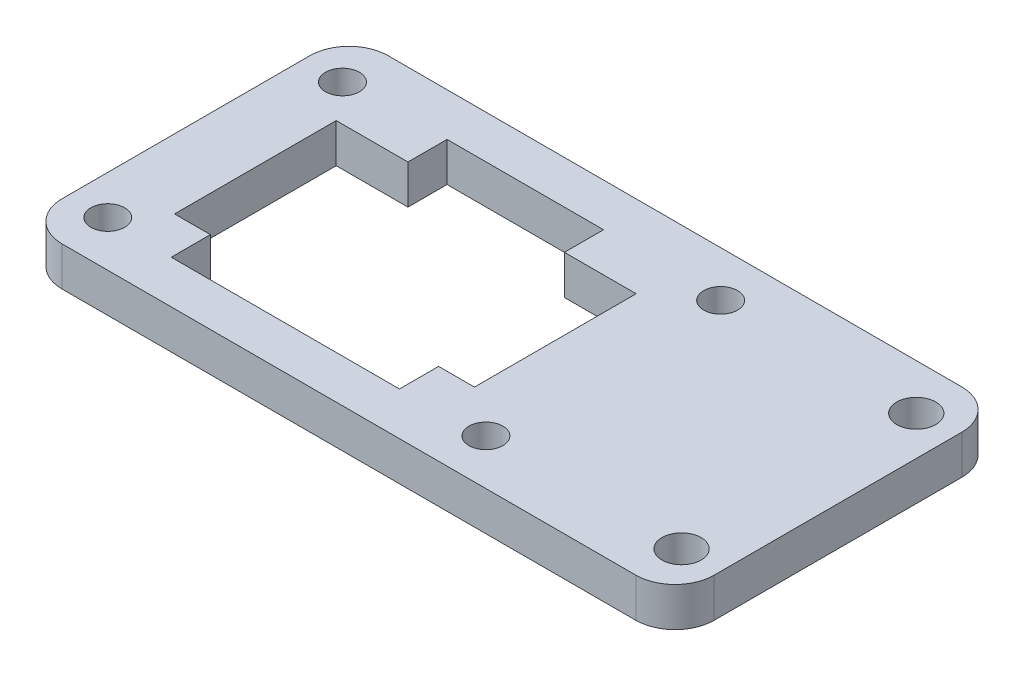
ISO-10303-21;
HEADER;
FILE_DESCRIPTION(('STEP AP214'),'2;1');
FILE_NAME('part.step','',(''),(''),'','','');
FILE_SCHEMA(('AUTOMOTIVE_DESIGN { 1 0 10303 214 1 1 1 1 }'));
ENDSEC;
DATA;
#1=APPLICATION_CONTEXT('core data for automotive mechanical design processes');
#2=APPLICATION_PROTOCOL_DEFINITION('international standard','automotive_design',2000,#1);
#3=PRODUCT_CONTEXT('',#1,'mechanical');
#4=PRODUCT('Part','Part','',(#3));
#5=PRODUCT_RELATED_PRODUCT_CATEGORY('part','',(#4));
#6=PRODUCT_DEFINITION_FORMATION('','',#4);
#7=PRODUCT_DEFINITION_CONTEXT('part definition',#1,'design');
#8=PRODUCT_DEFINITION('design','',#6,#7);
#9=PRODUCT_DEFINITION_SHAPE('','',#8);
#10=(LENGTH_UNIT() NAMED_UNIT(*) SI_UNIT(.MILLI.,.METRE.));
#11=(NAMED_UNIT(*) PLANE_ANGLE_UNIT() SI_UNIT($,.RADIAN.));
#12=(NAMED_UNIT(*) SI_UNIT($,.STERADIAN.) SOLID_ANGLE_UNIT());
#13=UNCERTAINTY_MEASURE_WITH_UNIT(LENGTH_MEASURE(1.E-05),#10,'distance_accuracy_value','');
#14=(GEOMETRIC_REPRESENTATION_CONTEXT(3) GLOBAL_UNCERTAINTY_ASSIGNED_CONTEXT((#13)) GLOBAL_UNIT_ASSIGNED_CONTEXT((#10,
#11,#12)) REPRESENTATION_CONTEXT('',''));
#15=CARTESIAN_POINT('',(0.,0.,0.));
#16=DIRECTION('',(0.,0.,1.));
#17=DIRECTION('',(1.,0.,0.));
#18=AXIS2_PLACEMENT_3D('',#15,#16,#17);
#19=CARTESIAN_POINT('',(3.32,3.,6.20000000000001));
#20=DIRECTION('',(0.,0.,1.));
#21=DIRECTION('',(1.,0.,0.));
#22=AXIS2_PLACEMENT_3D('',#19,#20,#21);
#23=PLANE('',#22);
#24=DIRECTION('',(-1.,0.,0.));
#25=VECTOR('',#24,1.);
#26=CARTESIAN_POINT('',(3.32,3.,6.20000000000001));
#27=LINE('',#26,#25);
#28=CARTESIAN_POINT('',(-16.93,3.,6.20000000000001));
#29=VERTEX_POINT('',#28);
#30=CARTESIAN_POINT('',(-19.68,3.,6.2));
#31=VERTEX_POINT('',#30);
#32=EDGE_CURVE('E251',#29,#31,#27,.T.);
#33=ORIENTED_EDGE('',*,*,#32,.F.);
#34=DIRECTION('',(0.,-1.,0.));
#35=VECTOR('',#34,1.);
#36=CARTESIAN_POINT('',(-16.93,3.,6.20000000000001));
#37=LINE('',#36,#35);
#38=CARTESIAN_POINT('',(-16.93,0.,6.20000000000001));
#39=VERTEX_POINT('',#38);
#40=EDGE_CURVE('E228',#29,#39,#37,.T.);
#41=ORIENTED_EDGE('',*,*,#40,.T.);
#42=DIRECTION('',(-1.,0.,0.));
#43=VECTOR('',#42,1.);
#44=CARTESIAN_POINT('',(3.32,0.,6.20000000000001));
#45=LINE('',#44,#43);
#46=CARTESIAN_POINT('',(-19.68,0.,6.2));
#47=VERTEX_POINT('',#46);
#48=EDGE_CURVE('E264',#39,#47,#45,.T.);
#49=ORIENTED_EDGE('',*,*,#48,.T.);
#50=DIRECTION('',(0.,-1.,0.));
#51=VECTOR('',#50,1.);
#52=CARTESIAN_POINT('',(-19.68,3.,6.2));
#53=LINE('',#52,#51);
#54=EDGE_CURVE('E267',#31,#47,#53,.T.);
#55=ORIENTED_EDGE('',*,*,#54,.F.);
#56=EDGE_LOOP('',(#33,#41,#49,#55));
#57=FACE_BOUND('',#56,.T.);
#58=ADVANCED_FACE('F36',(#57),#23,.F.);
#59=CARTESIAN_POINT('',(3.32,3.,-6.19999999999998));
#60=DIRECTION('',(0.,0.,-1.));
#61=DIRECTION('',(-1.,0.,0.));
#62=AXIS2_PLACEMENT_3D('',#59,#60,#61);
#63=PLANE('',#62);
#64=DIRECTION('',(1.,0.,0.));
#65=VECTOR('',#64,1.);
#66=CARTESIAN_POINT('',(3.32,0.,-6.19999999999998));
#67=LINE('',#66,#65);
#68=CARTESIAN_POINT('',(-19.68,0.,-6.2));
#69=VERTEX_POINT('',#68);
#70=CARTESIAN_POINT('',(-14.18,0.,-6.19999999999998));
#71=VERTEX_POINT('',#70);
#72=EDGE_CURVE('E258',#69,#71,#67,.T.);
#73=ORIENTED_EDGE('',*,*,#72,.T.);
#74=DIRECTION('',(0.,-1.,0.));
#75=VECTOR('',#74,1.);
#76=CARTESIAN_POINT('',(-14.18,3.,-6.19999999999998));
#77=LINE('',#76,#75);
#78=CARTESIAN_POINT('',(-14.18,3.,-6.19999999999998));
#79=VERTEX_POINT('',#78);
#80=EDGE_CURVE('E211',#79,#71,#77,.T.);
#81=ORIENTED_EDGE('',*,*,#80,.F.);
#82=DIRECTION('',(1.,0.,0.));
#83=VECTOR('',#82,1.);
#84=CARTESIAN_POINT('',(3.32,3.,-6.19999999999998));
#85=LINE('',#84,#83);
#86=CARTESIAN_POINT('',(-19.68,3.,-6.2));
#87=VERTEX_POINT('',#86);
#88=EDGE_CURVE('E198',#87,#79,#85,.T.);
#89=ORIENTED_EDGE('',*,*,#88,.F.);
#90=DIRECTION('',(0.,-1.,0.));
#91=VECTOR('',#90,1.);
#92=CARTESIAN_POINT('',(-19.68,3.,-6.2));
#93=LINE('',#92,#91);
#94=EDGE_CURVE('E255',#87,#69,#93,.T.);
#95=ORIENTED_EDGE('',*,*,#94,.T.);
#96=EDGE_LOOP('',(#73,#81,#89,#95));
#97=FACE_BOUND('',#96,.T.);
#98=ADVANCED_FACE('F365',(#97),#63,.F.);
#99=CARTESIAN_POINT('',(-25.,3.,12.5));
#100=DIRECTION('',(0.,0.,-1.));
#101=DIRECTION('',(-1.,0.,0.));
#102=AXIS2_PLACEMENT_3D('',#99,#100,#101);
#103=PLANE('',#102);
#104=DIRECTION('',(1.,0.,0.));
#105=VECTOR('',#104,1.);
#106=CARTESIAN_POINT('',(-25.,0.,12.5));
#107=LINE('',#106,#105);
#108=CARTESIAN_POINT('',(-22.,0.,12.5));
#109=VERTEX_POINT('',#108);
#110=CARTESIAN_POINT('',(22.,0.,12.5));
#111=VERTEX_POINT('',#110);
#112=EDGE_CURVE('E270',#109,#111,#107,.T.);
#113=ORIENTED_EDGE('',*,*,#112,.T.);
#114=DIRECTION('',(0.,-1.,0.));
#115=VECTOR('',#114,1.);
#116=CARTESIAN_POINT('',(22.,3.,12.5));
#117=LINE('',#116,#115);
#118=CARTESIAN_POINT('',(22.,3.,12.5));
#119=VERTEX_POINT('',#118);
#120=EDGE_CURVE('E11',#111,#119,#117,.F.);
#121=ORIENTED_EDGE('',*,*,#120,.T.);
#122=DIRECTION('',(1.,0.,0.));
#123=VECTOR('',#122,1.);
#124=CARTESIAN_POINT('',(-25.,3.,12.5));
#125=LINE('',#124,#123);
#126=CARTESIAN_POINT('',(-22.,3.,12.5));
#127=VERTEX_POINT('',#126);
#128=EDGE_CURVE('E278',#127,#119,#125,.T.);
#129=ORIENTED_EDGE('',*,*,#128,.F.);
#130=DIRECTION('',(0.,-1.,0.));
#131=VECTOR('',#130,1.);
#132=CARTESIAN_POINT('',(-22.,0.,12.5));
#133=LINE('',#132,#131);
#134=EDGE_CURVE('E44',#127,#109,#133,.T.);
#135=ORIENTED_EDGE('',*,*,#134,.T.);
#136=EDGE_LOOP('',(#113,#121,#129,#135));
#137=FACE_BOUND('',#136,.T.);
#138=ADVANCED_FACE('F331',(#137),#103,.F.);
#139=CARTESIAN_POINT('',(25.,3.,12.5));
#140=DIRECTION('',(-1.,0.,0.));
#141=DIRECTION('',(0.,0.,1.));
#142=AXIS2_PLACEMENT_3D('',#139,#140,#141);
#143=PLANE('',#142);
#144=DIRECTION('',(0.,0.,-1.));
#145=VECTOR('',#144,1.);
#146=CARTESIAN_POINT('',(25.,0.,12.5));
#147=LINE('',#146,#145);
#148=CARTESIAN_POINT('',(25.,0.,9.5));
#149=VERTEX_POINT('',#148);
#150=CARTESIAN_POINT('',(25.,0.,-9.5));
#151=VERTEX_POINT('',#150);
#152=EDGE_CURVE('E292',#149,#151,#147,.T.);
#153=ORIENTED_EDGE('',*,*,#152,.T.);
#154=DIRECTION('',(0.,-1.,0.));
#155=VECTOR('',#154,1.);
#156=CARTESIAN_POINT('',(25.,3.,-9.5));
#157=LINE('',#156,#155);
#158=CARTESIAN_POINT('',(25.,3.,-9.5));
#159=VERTEX_POINT('',#158);
#160=EDGE_CURVE('E51',#151,#159,#157,.F.);
#161=ORIENTED_EDGE('',*,*,#160,.T.);
#162=DIRECTION('',(0.,0.,-1.));
#163=VECTOR('',#162,1.);
#164=CARTESIAN_POINT('',(25.,3.,12.5));
#165=LINE('',#164,#163);
#166=CARTESIAN_POINT('',(25.,3.,9.5));
#167=VERTEX_POINT('',#166);
#168=EDGE_CURVE('E280',#167,#159,#165,.T.);
#169=ORIENTED_EDGE('',*,*,#168,.F.);
#170=DIRECTION('',(0.,-1.,0.));
#171=VECTOR('',#170,1.);
#172=CARTESIAN_POINT('',(25.,3.,9.5));
#173=LINE('',#172,#171);
#174=EDGE_CURVE('E323',#167,#149,#173,.T.);
#175=ORIENTED_EDGE('',*,*,#174,.T.);
#176=EDGE_LOOP('',(#153,#161,#169,#175));
#177=FACE_BOUND('',#176,.T.);
#178=ADVANCED_FACE('F342',(#177),#143,.F.);
#179=CARTESIAN_POINT('',(-25.,3.,-12.5));
#180=DIRECTION('',(0.,0.,-1.));
#181=DIRECTION('',(-1.,0.,0.));
#182=AXIS2_PLACEMENT_3D('',#179,#180,#181);
#183=PLANE('',#182);
#184=DIRECTION('',(1.,0.,0.));
#185=VECTOR('',#184,1.);
#186=CARTESIAN_POINT('',(-25.,0.,-12.5));
#187=LINE('',#186,#185);
#188=CARTESIAN_POINT('',(-22.,0.,-12.5));
#189=VERTEX_POINT('',#188);
#190=CARTESIAN_POINT('',(22.,0.,-12.5));
#191=VERTEX_POINT('',#190);
#192=EDGE_CURVE('E294',#189,#191,#187,.T.);
#193=ORIENTED_EDGE('',*,*,#192,.F.);
#194=DIRECTION('',(0.,-1.,0.));
#195=VECTOR('',#194,1.);
#196=CARTESIAN_POINT('',(-22.,3.,-12.5));
#197=LINE('',#196,#195);
#198=CARTESIAN_POINT('',(-22.,3.,-12.5));
#199=VERTEX_POINT('',#198);
#200=EDGE_CURVE('E314',#189,#199,#197,.F.);
#201=ORIENTED_EDGE('',*,*,#200,.T.);
#202=DIRECTION('',(1.,0.,0.));
#203=VECTOR('',#202,1.);
#204=CARTESIAN_POINT('',(-25.,3.,-12.5));
#205=LINE('',#204,#203);
#206=CARTESIAN_POINT('',(22.,3.,-12.5));
#207=VERTEX_POINT('',#206);
#208=EDGE_CURVE('E283',#199,#207,#205,.T.);
#209=ORIENTED_EDGE('',*,*,#208,.T.);
#210=DIRECTION('',(0.,-1.,0.));
#211=VECTOR('',#210,1.);
#212=CARTESIAN_POINT('',(22.,0.,-12.5));
#213=LINE('',#212,#211);
#214=EDGE_CURVE('E311',#207,#191,#213,.T.);
#215=ORIENTED_EDGE('',*,*,#214,.T.);
#216=EDGE_LOOP('',(#193,#201,#209,#215));
#217=FACE_BOUND('',#216,.T.);
#218=ADVANCED_FACE('F350',(#217),#183,.T.);
#219=CARTESIAN_POINT('',(-25.,3.,12.5));
#220=DIRECTION('',(-1.,0.,0.));
#221=DIRECTION('',(0.,0.,1.));
#222=AXIS2_PLACEMENT_3D('',#219,#220,#221);
#223=PLANE('',#222);
#224=DIRECTION('',(0.,0.,-1.));
#225=VECTOR('',#224,1.);
#226=CARTESIAN_POINT('',(-25.,3.,12.5));
#227=LINE('',#226,#225);
#228=CARTESIAN_POINT('',(-25.,3.,9.5));
#229=VERTEX_POINT('',#228);
#230=CARTESIAN_POINT('',(-25.,3.,-9.5));
#231=VERTEX_POINT('',#230);
#232=EDGE_CURVE('E286',#229,#231,#227,.T.);
#233=ORIENTED_EDGE('',*,*,#232,.T.);
#234=DIRECTION('',(0.,-1.,0.));
#235=VECTOR('',#234,1.);
#236=CARTESIAN_POINT('',(-25.,3.,-9.5));
#237=LINE('',#236,#235);
#238=CARTESIAN_POINT('',(-25.,0.,-9.5));
#239=VERTEX_POINT('',#238);
#240=EDGE_CURVE('E300',#231,#239,#237,.T.);
#241=ORIENTED_EDGE('',*,*,#240,.T.);
#242=DIRECTION('',(0.,0.,-1.));
#243=VECTOR('',#242,1.);
#244=CARTESIAN_POINT('',(-25.,0.,12.5));
#245=LINE('',#244,#243);
#246=CARTESIAN_POINT('',(-25.,0.,9.5));
#247=VERTEX_POINT('',#246);
#248=EDGE_CURVE('E281',#247,#239,#245,.T.);
#249=ORIENTED_EDGE('',*,*,#248,.F.);
#250=DIRECTION('',(0.,-1.,0.));
#251=VECTOR('',#250,1.);
#252=CARTESIAN_POINT('',(-25.,3.,9.5));
#253=LINE('',#252,#251);
#254=EDGE_CURVE('E289',#247,#229,#253,.F.);
#255=ORIENTED_EDGE('',*,*,#254,.T.);
#256=EDGE_LOOP('',(#233,#241,#249,#255));
#257=FACE_BOUND('',#256,.T.);
#258=ADVANCED_FACE('F357',(#257),#223,.T.);
#259=CARTESIAN_POINT('',(0.,3.,0.));
#260=DIRECTION('',(0.,1.,0.));
#261=DIRECTION('',(0.,0.,1.));
#262=AXIS2_PLACEMENT_3D('',#259,#260,#261);
#263=PLANE('',#262);
#264=CARTESIAN_POINT('',(-22.,3.,-9.));
#265=DIRECTION('',(0.,1.,0.));
#266=DIRECTION('',(0.,0.,1.));
#267=AXIS2_PLACEMENT_3D('',#264,#265,#266);
#268=CIRCLE('',#267,1.3);
#269=CARTESIAN_POINT('',(-22.,3.,-7.7));
#270=VERTEX_POINT('',#269);
#271=EDGE_CURVE('E661',#270,#270,#268,.T.);
#272=ORIENTED_EDGE('',*,*,#271,.F.);
#273=EDGE_LOOP('',(#272));
#274=FACE_BOUND('',#273,.T.);
#275=CARTESIAN_POINT('',(-22.,3.,9.));
#276=DIRECTION('',(0.,1.,0.));
#277=DIRECTION('',(0.,0.,1.));
#278=AXIS2_PLACEMENT_3D('',#275,#276,#277);
#279=CIRCLE('',#278,1.3);
#280=CARTESIAN_POINT('',(-22.,3.,10.3));
#281=VERTEX_POINT('',#280);
#282=EDGE_CURVE('E665',#281,#281,#279,.T.);
#283=ORIENTED_EDGE('',*,*,#282,.F.);
#284=EDGE_LOOP('',(#283));
#285=FACE_BOUND('',#284,.T.);
#286=CARTESIAN_POINT('',(7.,3.,-9.));
#287=DIRECTION('',(0.,1.,0.));
#288=DIRECTION('',(0.,0.,1.));
#289=AXIS2_PLACEMENT_3D('',#286,#287,#288);
#290=CIRCLE('',#289,1.3);
#291=CARTESIAN_POINT('',(7.,3.,-7.7));
#292=VERTEX_POINT('',#291);
#293=EDGE_CURVE('E669',#292,#292,#290,.T.);
#294=ORIENTED_EDGE('',*,*,#293,.F.);
#295=EDGE_LOOP('',(#294));
#296=FACE_BOUND('',#295,.T.);
#297=CARTESIAN_POINT('',(7.,3.,9.));
#298=DIRECTION('',(0.,1.,0.));
#299=DIRECTION('',(0.,0.,1.));
#300=AXIS2_PLACEMENT_3D('',#297,#298,#299);
#301=CIRCLE('',#300,1.3);
#302=CARTESIAN_POINT('',(7.,3.,10.3));
#303=VERTEX_POINT('',#302);
#304=EDGE_CURVE('E673',#303,#303,#301,.T.);
#305=ORIENTED_EDGE('',*,*,#304,.F.);
#306=EDGE_LOOP('',(#305));
#307=FACE_BOUND('',#306,.T.);
#308=CARTESIAN_POINT('',(22.,3.,-9.));
#309=DIRECTION('',(0.,1.,0.));
#310=DIRECTION('',(0.,0.,1.));
#311=AXIS2_PLACEMENT_3D('',#308,#309,#310);
#312=CIRCLE('',#311,1.49999999999999);
#313=CARTESIAN_POINT('',(22.,3.,-7.50000000000001));
#314=VERTEX_POINT('',#313);
#315=EDGE_CURVE('E677',#314,#314,#312,.T.);
#316=ORIENTED_EDGE('',*,*,#315,.F.);
#317=EDGE_LOOP('',(#316));
#318=FACE_BOUND('',#317,.T.);
#319=CARTESIAN_POINT('',(22.,3.,9.));
#320=DIRECTION('',(0.,1.,0.));
#321=DIRECTION('',(0.,0.,1.));
#322=AXIS2_PLACEMENT_3D('',#319,#320,#321);
#323=CIRCLE('',#322,1.49999999999999);
#324=CARTESIAN_POINT('',(22.,3.,10.5));
#325=VERTEX_POINT('',#324);
#326=EDGE_CURVE('E680',#325,#325,#323,.T.);
#327=ORIENTED_EDGE('',*,*,#326,.F.);
#328=EDGE_LOOP('',(#327));
#329=FACE_BOUND('',#328,.T.);
#330=DIRECTION('',(0.,0.,-1.));
#331=VECTOR('',#330,1.);
#332=CARTESIAN_POINT('',(-14.18,3.,-9.19999999999999));
#333=LINE('',#332,#331);
#334=CARTESIAN_POINT('',(-14.18,3.,-9.19999999999999));
#335=VERTEX_POINT('',#334);
#336=EDGE_CURVE('E177',#79,#335,#333,.T.);
#337=ORIENTED_EDGE('',*,*,#336,.T.);
#338=DIRECTION('',(1.,0.,0.));
#339=VECTOR('',#338,1.);
#340=CARTESIAN_POINT('',(-2.18,3.,-9.19999999999999));
#341=LINE('',#340,#339);
#342=CARTESIAN_POINT('',(-2.18,3.,-9.19999999999999));
#343=VERTEX_POINT('',#342);
#344=EDGE_CURVE('E188',#335,#343,#341,.T.);
#345=ORIENTED_EDGE('',*,*,#344,.T.);
#346=DIRECTION('',(0.,0.,1.));
#347=VECTOR('',#346,1.);
#348=CARTESIAN_POINT('',(-2.18,3.,-9.19999999999999));
#349=LINE('',#348,#347);
#350=CARTESIAN_POINT('',(-2.17999999999999,3.,-6.19999999999999));
#351=VERTEX_POINT('',#350);
#352=EDGE_CURVE('E185',#343,#351,#349,.T.);
#353=ORIENTED_EDGE('',*,*,#352,.T.);
#354=CARTESIAN_POINT('',(3.32,3.,-6.19999999999998));
#355=VERTEX_POINT('',#354);
#356=EDGE_CURVE('E245',#351,#355,#85,.T.);
#357=ORIENTED_EDGE('',*,*,#356,.T.);
#358=DIRECTION('',(0.,0.,1.));
#359=VECTOR('',#358,1.);
#360=CARTESIAN_POINT('',(3.32,3.,6.20000000000001));
#361=LINE('',#360,#359);
#362=CARTESIAN_POINT('',(3.32,3.,6.20000000000001));
#363=VERTEX_POINT('',#362);
#364=EDGE_CURVE('E248',#355,#363,#361,.T.);
#365=ORIENTED_EDGE('',*,*,#364,.T.);
#366=CARTESIAN_POINT('',(0.570000000000001,3.,6.20000000000001));
#367=VERTEX_POINT('',#366);
#368=EDGE_CURVE('E252',#363,#367,#27,.T.);
#369=ORIENTED_EDGE('',*,*,#368,.T.);
#370=DIRECTION('',(0.,0.,1.));
#371=VECTOR('',#370,1.);
#372=CARTESIAN_POINT('',(0.570000000000001,3.,9.20000000000001));
#373=LINE('',#372,#371);
#374=CARTESIAN_POINT('',(0.570000000000001,3.,9.20000000000001));
#375=VERTEX_POINT('',#374);
#376=EDGE_CURVE('E221',#367,#375,#373,.T.);
#377=ORIENTED_EDGE('',*,*,#376,.T.);
#378=DIRECTION('',(-1.,0.,0.));
#379=VECTOR('',#378,1.);
#380=CARTESIAN_POINT('',(0.570000000000001,3.,9.20000000000001));
#381=LINE('',#380,#379);
#382=CARTESIAN_POINT('',(-16.93,3.,9.20000000000001));
#383=VERTEX_POINT('',#382);
#384=EDGE_CURVE('E225',#375,#383,#381,.T.);
#385=ORIENTED_EDGE('',*,*,#384,.T.);
#386=DIRECTION('',(0.,0.,-1.));
#387=VECTOR('',#386,1.);
#388=CARTESIAN_POINT('',(-16.93,3.,9.20000000000001));
#389=LINE('',#388,#387);
#390=EDGE_CURVE('E218',#383,#29,#389,.T.);
#391=ORIENTED_EDGE('',*,*,#390,.T.);
#392=ORIENTED_EDGE('',*,*,#32,.T.);
#393=DIRECTION('',(0.,0.,-1.));
#394=VECTOR('',#393,1.);
#395=CARTESIAN_POINT('',(-19.68,3.,6.2));
#396=LINE('',#395,#394);
#397=EDGE_CURVE('E243',#31,#87,#396,.T.);
#398=ORIENTED_EDGE('',*,*,#397,.T.);
#399=ORIENTED_EDGE('',*,*,#88,.T.);
#400=EDGE_LOOP('',(#337,#345,#353,#357,#365,#369,#377,#385,#391,#392,#398,#399));
#401=FACE_BOUND('',#400,.T.);
#402=ORIENTED_EDGE('',*,*,#208,.F.);
#403=CARTESIAN_POINT('',(-22.,3.,-9.5));
#404=DIRECTION('',(0.,1.,0.));
#405=DIRECTION('',(0.,0.,1.));
#406=AXIS2_PLACEMENT_3D('',#403,#404,#405);
#407=CIRCLE('',#406,3.);
#408=EDGE_CURVE('E321',#199,#231,#407,.T.);
#409=ORIENTED_EDGE('',*,*,#408,.T.);
#410=ORIENTED_EDGE('',*,*,#232,.F.);
#411=CARTESIAN_POINT('',(-22.,3.,9.5));
#412=DIRECTION('',(0.,1.,0.));
#413=DIRECTION('',(0.,0.,1.));
#414=AXIS2_PLACEMENT_3D('',#411,#412,#413);
#415=CIRCLE('',#414,3.);
#416=EDGE_CURVE('E316',#229,#127,#415,.T.);
#417=ORIENTED_EDGE('',*,*,#416,.T.);
#418=ORIENTED_EDGE('',*,*,#128,.T.);
#419=CARTESIAN_POINT('',(22.,3.,9.5));
#420=DIRECTION('',(0.,1.,0.));
#421=DIRECTION('',(0.,0.,1.));
#422=AXIS2_PLACEMENT_3D('',#419,#420,#421);
#423=CIRCLE('',#422,3.);
#424=EDGE_CURVE('E58',#119,#167,#423,.T.);
#425=ORIENTED_EDGE('',*,*,#424,.T.);
#426=ORIENTED_EDGE('',*,*,#168,.T.);
#427=CARTESIAN_POINT('',(22.,3.,-9.5));
#428=DIRECTION('',(0.,1.,0.));
#429=DIRECTION('',(0.,0.,1.));
#430=AXIS2_PLACEMENT_3D('',#427,#428,#429);
#431=CIRCLE('',#430,3.);
#432=EDGE_CURVE('E319',#159,#207,#431,.T.);
#433=ORIENTED_EDGE('',*,*,#432,.T.);
#434=EDGE_LOOP('',(#402,#409,#410,#417,#418,#425,#426,#433));
#435=FACE_BOUND('',#434,.T.);
#436=ADVANCED_FACE('F195',(#274,#285,#296,#307,#318,#329,#401,#435),#263,.T.);
#437=CARTESIAN_POINT('',(0.,0.,0.));
#438=DIRECTION('',(0.,1.,0.));
#439=DIRECTION('',(0.,0.,1.));
#440=AXIS2_PLACEMENT_3D('',#437,#438,#439);
#441=PLANE('',#440);
#442=CARTESIAN_POINT('',(-22.,0.,-9.));
#443=DIRECTION('',(0.,1.,0.));
#444=DIRECTION('',(0.,0.,1.));
#445=AXIS2_PLACEMENT_3D('',#442,#443,#444);
#446=CIRCLE('',#445,1.3);
#447=CARTESIAN_POINT('',(-22.,0.,-7.7));
#448=VERTEX_POINT('',#447);
#449=EDGE_CURVE('E700',#448,#448,#446,.T.);
#450=ORIENTED_EDGE('',*,*,#449,.T.);
#451=EDGE_LOOP('',(#450));
#452=FACE_BOUND('',#451,.T.);
#453=CARTESIAN_POINT('',(-22.,0.,9.));
#454=DIRECTION('',(0.,1.,0.));
#455=DIRECTION('',(0.,0.,1.));
#456=AXIS2_PLACEMENT_3D('',#453,#454,#455);
#457=CIRCLE('',#456,1.3);
#458=CARTESIAN_POINT('',(-22.,0.,10.3));
#459=VERTEX_POINT('',#458);
#460=EDGE_CURVE('E696',#459,#459,#457,.T.);
#461=ORIENTED_EDGE('',*,*,#460,.T.);
#462=EDGE_LOOP('',(#461));
#463=FACE_BOUND('',#462,.T.);
#464=CARTESIAN_POINT('',(7.,0.,-9.));
#465=DIRECTION('',(0.,1.,0.));
#466=DIRECTION('',(0.,0.,1.));
#467=AXIS2_PLACEMENT_3D('',#464,#465,#466);
#468=CIRCLE('',#467,1.3);
#469=CARTESIAN_POINT('',(7.,0.,-7.7));
#470=VERTEX_POINT('',#469);
#471=EDGE_CURVE('E692',#470,#470,#468,.T.);
#472=ORIENTED_EDGE('',*,*,#471,.T.);
#473=EDGE_LOOP('',(#472));
#474=FACE_BOUND('',#473,.T.);
#475=CARTESIAN_POINT('',(7.,0.,9.));
#476=DIRECTION('',(0.,1.,0.));
#477=DIRECTION('',(0.,0.,1.));
#478=AXIS2_PLACEMENT_3D('',#475,#476,#477);
#479=CIRCLE('',#478,1.3);
#480=CARTESIAN_POINT('',(7.,0.,10.3));
#481=VERTEX_POINT('',#480);
#482=EDGE_CURVE('E688',#481,#481,#479,.T.);
#483=ORIENTED_EDGE('',*,*,#482,.T.);
#484=EDGE_LOOP('',(#483));
#485=FACE_BOUND('',#484,.T.);
#486=CARTESIAN_POINT('',(22.,0.,-9.));
#487=DIRECTION('',(0.,1.,0.));
#488=DIRECTION('',(0.,0.,1.));
#489=AXIS2_PLACEMENT_3D('',#486,#487,#488);
#490=CIRCLE('',#489,1.5);
#491=CARTESIAN_POINT('',(22.,0.,-7.5));
#492=VERTEX_POINT('',#491);
#493=EDGE_CURVE('E682',#492,#492,#490,.T.);
#494=ORIENTED_EDGE('',*,*,#493,.T.);
#495=EDGE_LOOP('',(#494));
#496=FACE_BOUND('',#495,.T.);
#497=CARTESIAN_POINT('',(22.,0.,9.));
#498=DIRECTION('',(0.,1.,0.));
#499=DIRECTION('',(0.,0.,1.));
#500=AXIS2_PLACEMENT_3D('',#497,#498,#499);
#501=CIRCLE('',#500,1.5);
#502=CARTESIAN_POINT('',(22.,0.,10.5));
#503=VERTEX_POINT('',#502);
#504=EDGE_CURVE('E204',#503,#503,#501,.T.);
#505=ORIENTED_EDGE('',*,*,#504,.T.);
#506=EDGE_LOOP('',(#505));
#507=FACE_BOUND('',#506,.T.);
#508=DIRECTION('',(1.,0.,0.));
#509=VECTOR('',#508,1.);
#510=CARTESIAN_POINT('',(-2.18,0.,-9.19999999999999));
#511=LINE('',#510,#509);
#512=CARTESIAN_POINT('',(-14.18,0.,-9.19999999999999));
#513=VERTEX_POINT('',#512);
#514=CARTESIAN_POINT('',(-2.18,0.,-9.19999999999999));
#515=VERTEX_POINT('',#514);
#516=EDGE_CURVE('E201',#513,#515,#511,.T.);
#517=ORIENTED_EDGE('',*,*,#516,.F.);
#518=DIRECTION('',(0.,0.,-1.));
#519=VECTOR('',#518,1.);
#520=CARTESIAN_POINT('',(-14.18,0.,-9.19999999999999));
#521=LINE('',#520,#519);
#522=EDGE_CURVE('E180',#71,#513,#521,.T.);
#523=ORIENTED_EDGE('',*,*,#522,.F.);
#524=ORIENTED_EDGE('',*,*,#72,.F.);
#525=DIRECTION('',(0.,0.,-1.));
#526=VECTOR('',#525,1.);
#527=CARTESIAN_POINT('',(-19.68,0.,6.2));
#528=LINE('',#527,#526);
#529=EDGE_CURVE('E213',#47,#69,#528,.T.);
#530=ORIENTED_EDGE('',*,*,#529,.F.);
#531=ORIENTED_EDGE('',*,*,#48,.F.);
#532=DIRECTION('',(0.,0.,-1.));
#533=VECTOR('',#532,1.);
#534=CARTESIAN_POINT('',(-16.93,0.,9.20000000000001));
#535=LINE('',#534,#533);
#536=CARTESIAN_POINT('',(-16.93,0.,9.20000000000001));
#537=VERTEX_POINT('',#536);
#538=EDGE_CURVE('E229',#537,#39,#535,.T.);
#539=ORIENTED_EDGE('',*,*,#538,.F.);
#540=DIRECTION('',(-1.,0.,0.));
#541=VECTOR('',#540,1.);
#542=CARTESIAN_POINT('',(0.570000000000001,0.,9.20000000000001));
#543=LINE('',#542,#541);
#544=CARTESIAN_POINT('',(0.570000000000001,0.,9.20000000000001));
#545=VERTEX_POINT('',#544);
#546=EDGE_CURVE('E222',#545,#537,#543,.T.);
#547=ORIENTED_EDGE('',*,*,#546,.F.);
#548=DIRECTION('',(0.,0.,1.));
#549=VECTOR('',#548,1.);
#550=CARTESIAN_POINT('',(0.570000000000001,0.,9.20000000000001));
#551=LINE('',#550,#549);
#552=CARTESIAN_POINT('',(0.569999999999987,0.,6.20000000000001));
#553=VERTEX_POINT('',#552);
#554=EDGE_CURVE('E231',#553,#545,#551,.T.);
#555=ORIENTED_EDGE('',*,*,#554,.F.);
#556=CARTESIAN_POINT('',(3.32,0.,6.20000000000001));
#557=VERTEX_POINT('',#556);
#558=EDGE_CURVE('E246',#557,#553,#45,.T.);
#559=ORIENTED_EDGE('',*,*,#558,.F.);
#560=DIRECTION('',(0.,0.,1.));
#561=VECTOR('',#560,1.);
#562=CARTESIAN_POINT('',(3.32,0.,6.20000000000001));
#563=LINE('',#562,#561);
#564=CARTESIAN_POINT('',(3.32,0.,-6.19999999999998));
#565=VERTEX_POINT('',#564);
#566=EDGE_CURVE('E261',#565,#557,#563,.T.);
#567=ORIENTED_EDGE('',*,*,#566,.F.);
#568=CARTESIAN_POINT('',(-2.17999999999999,0.,-6.19999999999999));
#569=VERTEX_POINT('',#568);
#570=EDGE_CURVE('E257',#569,#565,#67,.T.);
#571=ORIENTED_EDGE('',*,*,#570,.F.);
#572=DIRECTION('',(0.,0.,1.));
#573=VECTOR('',#572,1.);
#574=CARTESIAN_POINT('',(-2.18,0.,-9.19999999999999));
#575=LINE('',#574,#573);
#576=EDGE_CURVE('E199',#515,#569,#575,.T.);
#577=ORIENTED_EDGE('',*,*,#576,.F.);
#578=EDGE_LOOP('',(#517,#523,#524,#530,#531,#539,#547,#555,#559,#567,#571,#577));
#579=FACE_BOUND('',#578,.T.);
#580=ORIENTED_EDGE('',*,*,#248,.T.);
#581=CARTESIAN_POINT('',(-22.,0.,-9.5));
#582=DIRECTION('',(0.,1.,0.));
#583=DIRECTION('',(0.,0.,1.));
#584=AXIS2_PLACEMENT_3D('',#581,#582,#583);
#585=CIRCLE('',#584,3.);
#586=EDGE_CURVE('E309',#239,#189,#585,.F.);
#587=ORIENTED_EDGE('',*,*,#586,.T.);
#588=ORIENTED_EDGE('',*,*,#192,.T.);
#589=CARTESIAN_POINT('',(22.,0.,-9.5));
#590=DIRECTION('',(0.,1.,0.));
#591=DIRECTION('',(0.,0.,1.));
#592=AXIS2_PLACEMENT_3D('',#589,#590,#591);
#593=CIRCLE('',#592,3.);
#594=EDGE_CURVE('E307',#191,#151,#593,.F.);
#595=ORIENTED_EDGE('',*,*,#594,.T.);
#596=ORIENTED_EDGE('',*,*,#152,.F.);
#597=CARTESIAN_POINT('',(22.,0.,9.5));
#598=DIRECTION('',(0.,1.,0.));
#599=DIRECTION('',(0.,0.,1.));
#600=AXIS2_PLACEMENT_3D('',#597,#598,#599);
#601=CIRCLE('',#600,3.);
#602=EDGE_CURVE('E305',#149,#111,#601,.F.);
#603=ORIENTED_EDGE('',*,*,#602,.T.);
#604=ORIENTED_EDGE('',*,*,#112,.F.);
#605=CARTESIAN_POINT('',(-22.,0.,9.5));
#606=DIRECTION('',(0.,1.,0.));
#607=DIRECTION('',(0.,0.,1.));
#608=AXIS2_PLACEMENT_3D('',#605,#606,#607);
#609=CIRCLE('',#608,3.);
#610=EDGE_CURVE('E303',#109,#247,#609,.F.);
#611=ORIENTED_EDGE('',*,*,#610,.T.);
#612=EDGE_LOOP('',(#580,#587,#588,#595,#596,#603,#604,#611));
#613=FACE_BOUND('',#612,.T.);
#614=ADVANCED_FACE('F336',(#452,#463,#474,#485,#496,#507,#579,#613),#441,.F.);
#615=CARTESIAN_POINT('',(-19.68,3.,6.2));
#616=DIRECTION('',(-1.,0.,0.));
#617=DIRECTION('',(0.,0.,1.));
#618=AXIS2_PLACEMENT_3D('',#615,#616,#617);
#619=PLANE('',#618);
#620=ORIENTED_EDGE('',*,*,#529,.T.);
#621=ORIENTED_EDGE('',*,*,#94,.F.);
#622=ORIENTED_EDGE('',*,*,#397,.F.);
#623=ORIENTED_EDGE('',*,*,#54,.T.);
#624=EDGE_LOOP('',(#620,#621,#622,#623));
#625=FACE_BOUND('',#624,.T.);
#626=ADVANCED_FACE('F380',(#625),#619,.F.);
#627=ORIENTED_EDGE('',*,*,#558,.T.);
#628=DIRECTION('',(0.,-1.,0.));
#629=VECTOR('',#628,1.);
#630=CARTESIAN_POINT('',(0.569999999999987,3.,6.20000000000001));
#631=LINE('',#630,#629);
#632=EDGE_CURVE('E239',#367,#553,#631,.T.);
#633=ORIENTED_EDGE('',*,*,#632,.F.);
#634=ORIENTED_EDGE('',*,*,#368,.F.);
#635=DIRECTION('',(0.,-1.,0.));
#636=VECTOR('',#635,1.);
#637=CARTESIAN_POINT('',(3.32,3.,6.20000000000001));
#638=LINE('',#637,#636);
#639=EDGE_CURVE('E271',#363,#557,#638,.T.);
#640=ORIENTED_EDGE('',*,*,#639,.T.);
#641=EDGE_LOOP('',(#627,#633,#634,#640));
#642=FACE_BOUND('',#641,.T.);
#643=ADVANCED_FACE('F368',(#642),#23,.F.);
#644=CARTESIAN_POINT('',(3.32,3.,6.20000000000001));
#645=DIRECTION('',(1.,0.,0.));
#646=DIRECTION('',(0.,0.,-1.));
#647=AXIS2_PLACEMENT_3D('',#644,#645,#646);
#648=PLANE('',#647);
#649=ORIENTED_EDGE('',*,*,#566,.T.);
#650=ORIENTED_EDGE('',*,*,#639,.F.);
#651=ORIENTED_EDGE('',*,*,#364,.F.);
#652=DIRECTION('',(0.,-1.,0.));
#653=VECTOR('',#652,1.);
#654=CARTESIAN_POINT('',(3.32,3.,-6.19999999999998));
#655=LINE('',#654,#653);
#656=EDGE_CURVE('E273',#355,#565,#655,.T.);
#657=ORIENTED_EDGE('',*,*,#656,.T.);
#658=EDGE_LOOP('',(#649,#650,#651,#657));
#659=FACE_BOUND('',#658,.T.);
#660=ADVANCED_FACE('F379',(#659),#648,.F.);
#661=ORIENTED_EDGE('',*,*,#356,.F.);
#662=DIRECTION('',(0.,-1.,0.));
#663=VECTOR('',#662,1.);
#664=CARTESIAN_POINT('',(-2.17999999999999,3.,-6.19999999999999));
#665=LINE('',#664,#663);
#666=EDGE_CURVE('E214',#351,#569,#665,.T.);
#667=ORIENTED_EDGE('',*,*,#666,.T.);
#668=ORIENTED_EDGE('',*,*,#570,.T.);
#669=ORIENTED_EDGE('',*,*,#656,.F.);
#670=EDGE_LOOP('',(#661,#667,#668,#669));
#671=FACE_BOUND('',#670,.T.);
#672=ADVANCED_FACE('F374',(#671),#63,.F.);
#673=CARTESIAN_POINT('',(-14.18,3.,-9.19999999999999));
#674=DIRECTION('',(-1.,0.,0.));
#675=DIRECTION('',(0.,0.,1.));
#676=AXIS2_PLACEMENT_3D('',#673,#674,#675);
#677=PLANE('',#676);
#678=ORIENTED_EDGE('',*,*,#522,.T.);
#679=DIRECTION('',(0.,-1.,0.));
#680=VECTOR('',#679,1.);
#681=CARTESIAN_POINT('',(-14.18,3.,-9.19999999999999));
#682=LINE('',#681,#680);
#683=EDGE_CURVE('E173',#335,#513,#682,.T.);
#684=ORIENTED_EDGE('',*,*,#683,.F.);
#685=ORIENTED_EDGE('',*,*,#336,.F.);
#686=ORIENTED_EDGE('',*,*,#80,.T.);
#687=EDGE_LOOP('',(#678,#684,#685,#686));
#688=FACE_BOUND('',#687,.T.);
#689=ADVANCED_FACE('F175',(#688),#677,.F.);
#690=CARTESIAN_POINT('',(-2.18,3.,-9.19999999999999));
#691=DIRECTION('',(1.,0.,0.));
#692=DIRECTION('',(0.,0.,-1.));
#693=AXIS2_PLACEMENT_3D('',#690,#691,#692);
#694=PLANE('',#693);
#695=ORIENTED_EDGE('',*,*,#576,.T.);
#696=ORIENTED_EDGE('',*,*,#666,.F.);
#697=ORIENTED_EDGE('',*,*,#352,.F.);
#698=DIRECTION('',(0.,-1.,0.));
#699=VECTOR('',#698,1.);
#700=CARTESIAN_POINT('',(-2.18,3.,-9.19999999999999));
#701=LINE('',#700,#699);
#702=EDGE_CURVE('E184',#343,#515,#701,.T.);
#703=ORIENTED_EDGE('',*,*,#702,.T.);
#704=EDGE_LOOP('',(#695,#696,#697,#703));
#705=FACE_BOUND('',#704,.T.);
#706=ADVANCED_FACE('F407',(#705),#694,.F.);
#707=CARTESIAN_POINT('',(-2.18,3.,-9.19999999999999));
#708=DIRECTION('',(0.,0.,-1.));
#709=DIRECTION('',(-1.,0.,0.));
#710=AXIS2_PLACEMENT_3D('',#707,#708,#709);
#711=PLANE('',#710);
#712=ORIENTED_EDGE('',*,*,#516,.T.);
#713=ORIENTED_EDGE('',*,*,#702,.F.);
#714=ORIENTED_EDGE('',*,*,#344,.F.);
#715=ORIENTED_EDGE('',*,*,#683,.T.);
#716=EDGE_LOOP('',(#712,#713,#714,#715));
#717=FACE_BOUND('',#716,.T.);
#718=ADVANCED_FACE('F189',(#717),#711,.F.);
#719=CARTESIAN_POINT('',(-16.93,3.,9.20000000000001));
#720=DIRECTION('',(-1.,0.,0.));
#721=DIRECTION('',(0.,0.,1.));
#722=AXIS2_PLACEMENT_3D('',#719,#720,#721);
#723=PLANE('',#722);
#724=ORIENTED_EDGE('',*,*,#538,.T.);
#725=ORIENTED_EDGE('',*,*,#40,.F.);
#726=ORIENTED_EDGE('',*,*,#390,.F.);
#727=DIRECTION('',(0.,-1.,0.));
#728=VECTOR('',#727,1.);
#729=CARTESIAN_POINT('',(-16.93,3.,9.20000000000001));
#730=LINE('',#729,#728);
#731=EDGE_CURVE('E209',#383,#537,#730,.T.);
#732=ORIENTED_EDGE('',*,*,#731,.T.);
#733=EDGE_LOOP('',(#724,#725,#726,#732));
#734=FACE_BOUND('',#733,.T.);
#735=ADVANCED_FACE('F414',(#734),#723,.F.);
#736=CARTESIAN_POINT('',(0.570000000000001,3.,9.20000000000001));
#737=DIRECTION('',(0.,0.,1.));
#738=DIRECTION('',(1.,0.,0.));
#739=AXIS2_PLACEMENT_3D('',#736,#737,#738);
#740=PLANE('',#739);
#741=ORIENTED_EDGE('',*,*,#546,.T.);
#742=ORIENTED_EDGE('',*,*,#731,.F.);
#743=ORIENTED_EDGE('',*,*,#384,.F.);
#744=DIRECTION('',(0.,-1.,0.));
#745=VECTOR('',#744,1.);
#746=CARTESIAN_POINT('',(0.570000000000001,3.,9.20000000000001));
#747=LINE('',#746,#745);
#748=EDGE_CURVE('E237',#375,#545,#747,.T.);
#749=ORIENTED_EDGE('',*,*,#748,.T.);
#750=EDGE_LOOP('',(#741,#742,#743,#749));
#751=FACE_BOUND('',#750,.T.);
#752=ADVANCED_FACE('F421',(#751),#740,.F.);
#753=CARTESIAN_POINT('',(0.570000000000001,3.,9.20000000000001));
#754=DIRECTION('',(1.,0.,0.));
#755=DIRECTION('',(0.,0.,-1.));
#756=AXIS2_PLACEMENT_3D('',#753,#754,#755);
#757=PLANE('',#756);
#758=ORIENTED_EDGE('',*,*,#554,.T.);
#759=ORIENTED_EDGE('',*,*,#748,.F.);
#760=ORIENTED_EDGE('',*,*,#376,.F.);
#761=ORIENTED_EDGE('',*,*,#632,.T.);
#762=EDGE_LOOP('',(#758,#759,#760,#761));
#763=FACE_BOUND('',#762,.T.);
#764=ADVANCED_FACE('F399',(#763),#757,.F.);
#765=CARTESIAN_POINT('',(22.,3.,9.));
#766=DIRECTION('',(0.,1.,0.));
#767=DIRECTION('',(0.,0.,1.));
#768=AXIS2_PLACEMENT_3D('',#765,#766,#767);
#769=CYLINDRICAL_SURFACE('',#768,1.49999999999999);
#770=ORIENTED_EDGE('',*,*,#504,.F.);
#771=EDGE_LOOP('',(#770));
#772=FACE_BOUND('',#771,.T.);
#773=ORIENTED_EDGE('',*,*,#326,.T.);
#774=EDGE_LOOP('',(#773));
#775=FACE_BOUND('',#774,.T.);
#776=ADVANCED_FACE('F418',(#772,#775),#769,.F.);
#777=CARTESIAN_POINT('',(22.,3.,-9.));
#778=DIRECTION('',(0.,1.,0.));
#779=DIRECTION('',(0.,0.,1.));
#780=AXIS2_PLACEMENT_3D('',#777,#778,#779);
#781=CYLINDRICAL_SURFACE('',#780,1.49999999999999);
#782=ORIENTED_EDGE('',*,*,#493,.F.);
#783=EDGE_LOOP('',(#782));
#784=FACE_BOUND('',#783,.T.);
#785=ORIENTED_EDGE('',*,*,#315,.T.);
#786=EDGE_LOOP('',(#785));
#787=FACE_BOUND('',#786,.T.);
#788=ADVANCED_FACE('F452',(#784,#787),#781,.F.);
#789=CARTESIAN_POINT('',(7.,3.,9.));
#790=DIRECTION('',(0.,1.,0.));
#791=DIRECTION('',(0.,0.,1.));
#792=AXIS2_PLACEMENT_3D('',#789,#790,#791);
#793=CYLINDRICAL_SURFACE('',#792,1.3);
#794=ORIENTED_EDGE('',*,*,#482,.F.);
#795=EDGE_LOOP('',(#794));
#796=FACE_BOUND('',#795,.T.);
#797=ORIENTED_EDGE('',*,*,#304,.T.);
#798=EDGE_LOOP('',(#797));
#799=FACE_BOUND('',#798,.T.);
#800=ADVANCED_FACE('F459',(#796,#799),#793,.F.);
#801=CARTESIAN_POINT('',(7.,3.,-9.));
#802=DIRECTION('',(0.,1.,0.));
#803=DIRECTION('',(0.,0.,1.));
#804=AXIS2_PLACEMENT_3D('',#801,#802,#803);
#805=CYLINDRICAL_SURFACE('',#804,1.3);
#806=ORIENTED_EDGE('',*,*,#471,.F.);
#807=EDGE_LOOP('',(#806));
#808=FACE_BOUND('',#807,.T.);
#809=ORIENTED_EDGE('',*,*,#293,.T.);
#810=EDGE_LOOP('',(#809));
#811=FACE_BOUND('',#810,.T.);
#812=ADVANCED_FACE('F466',(#808,#811),#805,.F.);
#813=CARTESIAN_POINT('',(-22.,3.,9.));
#814=DIRECTION('',(0.,1.,0.));
#815=DIRECTION('',(0.,0.,1.));
#816=AXIS2_PLACEMENT_3D('',#813,#814,#815);
#817=CYLINDRICAL_SURFACE('',#816,1.3);
#818=ORIENTED_EDGE('',*,*,#460,.F.);
#819=EDGE_LOOP('',(#818));
#820=FACE_BOUND('',#819,.T.);
#821=ORIENTED_EDGE('',*,*,#282,.T.);
#822=EDGE_LOOP('',(#821));
#823=FACE_BOUND('',#822,.T.);
#824=ADVANCED_FACE('F474',(#820,#823),#817,.F.);
#825=CARTESIAN_POINT('',(-22.,3.,-9.));
#826=DIRECTION('',(0.,1.,0.));
#827=DIRECTION('',(0.,0.,1.));
#828=AXIS2_PLACEMENT_3D('',#825,#826,#827);
#829=CYLINDRICAL_SURFACE('',#828,1.3);
#830=ORIENTED_EDGE('',*,*,#449,.F.);
#831=EDGE_LOOP('',(#830));
#832=FACE_BOUND('',#831,.T.);
#833=ORIENTED_EDGE('',*,*,#271,.T.);
#834=EDGE_LOOP('',(#833));
#835=FACE_BOUND('',#834,.T.);
#836=ADVANCED_FACE('F482',(#832,#835),#829,.F.);
#837=CARTESIAN_POINT('',(-22.,3.,-9.5));
#838=DIRECTION('',(0.,-1.,0.));
#839=DIRECTION('',(0.,0.,-1.));
#840=AXIS2_PLACEMENT_3D('',#837,#838,#839);
#841=CYLINDRICAL_SURFACE('',#840,3.);
#842=ORIENTED_EDGE('',*,*,#408,.F.);
#843=ORIENTED_EDGE('',*,*,#200,.F.);
#844=ORIENTED_EDGE('',*,*,#586,.F.);
#845=ORIENTED_EDGE('',*,*,#240,.F.);
#846=EDGE_LOOP('',(#842,#843,#844,#845));
#847=FACE_BOUND('',#846,.T.);
#848=ADVANCED_FACE('F355',(#847),#841,.T.);
#849=CARTESIAN_POINT('',(22.,3.,-9.5));
#850=DIRECTION('',(0.,1.,0.));
#851=DIRECTION('',(0.,0.,1.));
#852=AXIS2_PLACEMENT_3D('',#849,#850,#851);
#853=CYLINDRICAL_SURFACE('',#852,3.);
#854=ORIENTED_EDGE('',*,*,#432,.F.);
#855=ORIENTED_EDGE('',*,*,#160,.F.);
#856=ORIENTED_EDGE('',*,*,#594,.F.);
#857=ORIENTED_EDGE('',*,*,#214,.F.);
#858=EDGE_LOOP('',(#854,#855,#856,#857));
#859=FACE_BOUND('',#858,.T.);
#860=ADVANCED_FACE('F347',(#859),#853,.T.);
#861=CARTESIAN_POINT('',(22.,3.,9.5));
#862=DIRECTION('',(0.,-1.,0.));
#863=DIRECTION('',(0.,0.,-1.));
#864=AXIS2_PLACEMENT_3D('',#861,#862,#863);
#865=CYLINDRICAL_SURFACE('',#864,3.);
#866=ORIENTED_EDGE('',*,*,#424,.F.);
#867=ORIENTED_EDGE('',*,*,#120,.F.);
#868=ORIENTED_EDGE('',*,*,#602,.F.);
#869=ORIENTED_EDGE('',*,*,#174,.F.);
#870=EDGE_LOOP('',(#866,#867,#868,#869));
#871=FACE_BOUND('',#870,.T.);
#872=ADVANCED_FACE('F341',(#871),#865,.T.);
#873=CARTESIAN_POINT('',(-22.,3.,9.5));
#874=DIRECTION('',(0.,1.,0.));
#875=DIRECTION('',(0.,0.,1.));
#876=AXIS2_PLACEMENT_3D('',#873,#874,#875);
#877=CYLINDRICAL_SURFACE('',#876,3.);
#878=ORIENTED_EDGE('',*,*,#416,.F.);
#879=ORIENTED_EDGE('',*,*,#254,.F.);
#880=ORIENTED_EDGE('',*,*,#610,.F.);
#881=ORIENTED_EDGE('',*,*,#134,.F.);
#882=EDGE_LOOP('',(#878,#879,#880,#881));
#883=FACE_BOUND('',#882,.T.);
#884=ADVANCED_FACE('F38',(#883),#877,.T.);
#885=CLOSED_SHELL('',(#58,#98,#138,#178,#218,#258,#436,#614,#626,#643,#660,#672,#689,#706,#718,
#735,#752,#764,#776,#788,#800,#812,#824,#836,#848,#860,#872,#884));
#886=MANIFOLD_SOLID_BREP('B2',#885);
#887=ADVANCED_BREP_SHAPE_REPRESENTATION('',(#18,#886),#14);
#888=SHAPE_DEFINITION_REPRESENTATION(#9,#887);
ENDSEC;
END-ISO-10303-21;
